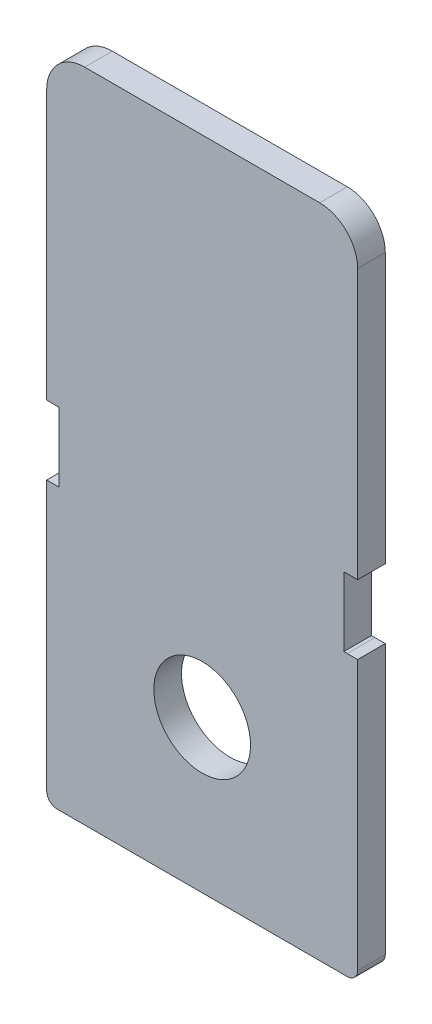
ISO-10303-21;
HEADER;
FILE_DESCRIPTION(('STEP AP214'),'2;1');
FILE_NAME('part.step','',(''),(''),'','','');
FILE_SCHEMA(('AUTOMOTIVE_DESIGN { 1 0 10303 214 1 1 1 1 }'));
ENDSEC;
DATA;
#1=APPLICATION_CONTEXT('core data for automotive mechanical design processes');
#2=APPLICATION_PROTOCOL_DEFINITION('international standard','automotive_design',2000,#1);
#3=PRODUCT_CONTEXT('',#1,'mechanical');
#4=PRODUCT('Part','Part','',(#3));
#5=PRODUCT_RELATED_PRODUCT_CATEGORY('part','',(#4));
#6=PRODUCT_DEFINITION_FORMATION('','',#4);
#7=PRODUCT_DEFINITION_CONTEXT('part definition',#1,'design');
#8=PRODUCT_DEFINITION('design','',#6,#7);
#9=PRODUCT_DEFINITION_SHAPE('','',#8);
#10=(LENGTH_UNIT() NAMED_UNIT(*) SI_UNIT(.MILLI.,.METRE.));
#11=(NAMED_UNIT(*) PLANE_ANGLE_UNIT() SI_UNIT($,.RADIAN.));
#12=(NAMED_UNIT(*) SI_UNIT($,.STERADIAN.) SOLID_ANGLE_UNIT());
#13=UNCERTAINTY_MEASURE_WITH_UNIT(LENGTH_MEASURE(1.E-05),#10,'distance_accuracy_value','');
#14=(GEOMETRIC_REPRESENTATION_CONTEXT(3) GLOBAL_UNCERTAINTY_ASSIGNED_CONTEXT((#13)) GLOBAL_UNIT_ASSIGNED_CONTEXT((#10,
#11,#12)) REPRESENTATION_CONTEXT('',''));
#15=CARTESIAN_POINT('',(0.,0.,0.));
#16=DIRECTION('',(0.,0.,1.));
#17=DIRECTION('',(1.,0.,0.));
#18=AXIS2_PLACEMENT_3D('',#15,#16,#17);
#19=CARTESIAN_POINT('',(11.25,103.5,32.25));
#20=DIRECTION('',(-1.,0.,0.));
#21=DIRECTION('',(0.,0.,1.));
#22=AXIS2_PLACEMENT_3D('',#19,#20,#21);
#23=PLANE('',#22);
#24=DIRECTION('',(0.,1.,0.));
#25=VECTOR('',#24,1.);
#26=CARTESIAN_POINT('',(11.25,79.,32.25));
#27=LINE('',#26,#25);
#28=CARTESIAN_POINT('',(11.25,103.5,32.25));
#29=VERTEX_POINT('',#28);
#30=CARTESIAN_POINT('',(11.25,123.,32.25));
#31=VERTEX_POINT('',#30);
#32=EDGE_CURVE('E257',#29,#31,#27,.T.);
#33=ORIENTED_EDGE('',*,*,#32,.F.);
#34=DIRECTION('',(0.,0.,1.));
#35=VECTOR('',#34,1.);
#36=CARTESIAN_POINT('',(11.25,103.5,30.25));
#37=LINE('',#36,#35);
#38=CARTESIAN_POINT('',(11.25,103.5,30.25));
#39=VERTEX_POINT('',#38);
#40=EDGE_CURVE('E231',#39,#29,#37,.T.);
#41=ORIENTED_EDGE('',*,*,#40,.F.);
#42=DIRECTION('',(0.,1.,0.));
#43=VECTOR('',#42,1.);
#44=CARTESIAN_POINT('',(11.25,103.5,30.25));
#45=LINE('',#44,#43);
#46=CARTESIAN_POINT('',(11.25,123.,30.25));
#47=VERTEX_POINT('',#46);
#48=EDGE_CURVE('E277',#39,#47,#45,.T.);
#49=ORIENTED_EDGE('',*,*,#48,.T.);
#50=DIRECTION('',(0.,0.,-1.));
#51=VECTOR('',#50,1.);
#52=CARTESIAN_POINT('',(11.25,123.,32.25));
#53=LINE('',#52,#51);
#54=EDGE_CURVE('E302',#31,#47,#53,.T.);
#55=ORIENTED_EDGE('',*,*,#54,.F.);
#56=EDGE_LOOP('',(#33,#41,#49,#55));
#57=FACE_BOUND('',#56,.T.);
#58=ADVANCED_FACE('F52',(#57),#23,.F.);
#59=CARTESIAN_POINT('',(-11.25,98.5,32.25));
#60=DIRECTION('',(1.,0.,0.));
#61=DIRECTION('',(0.,1.,0.));
#62=AXIS2_PLACEMENT_3D('',#59,#60,#61);
#63=PLANE('',#62);
#64=DIRECTION('',(0.,-1.,0.));
#65=VECTOR('',#64,1.);
#66=CARTESIAN_POINT('',(-11.2499999999986,123.000004119294,32.25));
#67=LINE('',#66,#65);
#68=CARTESIAN_POINT('',(-11.2499999999992,98.5,32.25));
#69=VERTEX_POINT('',#68);
#70=CARTESIAN_POINT('',(-11.25,79.,32.25));
#71=VERTEX_POINT('',#70);
#72=EDGE_CURVE('E267',#69,#71,#67,.T.);
#73=ORIENTED_EDGE('',*,*,#72,.F.);
#74=DIRECTION('',(0.,0.,1.));
#75=VECTOR('',#74,1.);
#76=CARTESIAN_POINT('',(-11.2499999999992,98.5,30.25));
#77=LINE('',#76,#75);
#78=CARTESIAN_POINT('',(-11.2499999999992,98.5,30.25));
#79=VERTEX_POINT('',#78);
#80=EDGE_CURVE('E229',#79,#69,#77,.T.);
#81=ORIENTED_EDGE('',*,*,#80,.F.);
#82=DIRECTION('',(0.,-1.,0.));
#83=VECTOR('',#82,1.);
#84=CARTESIAN_POINT('',(-11.25,98.5,30.25));
#85=LINE('',#84,#83);
#86=CARTESIAN_POINT('',(-11.25,79.,30.25));
#87=VERTEX_POINT('',#86);
#88=EDGE_CURVE('E288',#79,#87,#85,.T.);
#89=ORIENTED_EDGE('',*,*,#88,.T.);
#90=DIRECTION('',(0.,0.,-1.));
#91=VECTOR('',#90,1.);
#92=CARTESIAN_POINT('',(-11.25,79.,32.25));
#93=LINE('',#92,#91);
#94=EDGE_CURVE('E269',#71,#87,#93,.T.);
#95=ORIENTED_EDGE('',*,*,#94,.F.);
#96=EDGE_LOOP('',(#73,#81,#89,#95));
#97=FACE_BOUND('',#96,.T.);
#98=ADVANCED_FACE('F352',(#97),#63,.F.);
#99=CARTESIAN_POINT('',(-10.5,79.,32.25));
#100=DIRECTION('',(0.,0.,1.));
#101=DIRECTION('',(1.,0.,0.));
#102=AXIS2_PLACEMENT_3D('',#99,#100,#101);
#103=PLANE('',#102);
#104=CARTESIAN_POINT('',(0.,89.25,32.25));
#105=DIRECTION('',(0.,0.,1.));
#106=DIRECTION('',(1.,0.,0.));
#107=AXIS2_PLACEMENT_3D('',#104,#105,#106);
#108=CIRCLE('',#107,3.5);
#109=CARTESIAN_POINT('',(3.5,89.25,32.25));
#110=VERTEX_POINT('',#109);
#111=EDGE_CURVE('E201',#110,#110,#108,.T.);
#112=ORIENTED_EDGE('',*,*,#111,.F.);
#113=EDGE_LOOP('',(#112));
#114=FACE_BOUND('',#113,.T.);
#115=DIRECTION('',(-1.,0.,0.));
#116=VECTOR('',#115,1.);
#117=CARTESIAN_POINT('',(-10.5,103.5,32.25));
#118=LINE('',#117,#116);
#119=CARTESIAN_POINT('',(10.25,103.5,32.25));
#120=VERTEX_POINT('',#119);
#121=EDGE_CURVE('E246',#29,#120,#118,.T.);
#122=ORIENTED_EDGE('',*,*,#121,.F.);
#123=ORIENTED_EDGE('',*,*,#32,.T.);
#124=CARTESIAN_POINT('',(8.5,123.,32.25));
#125=DIRECTION('',(0.,0.,1.));
#126=DIRECTION('',(1.,0.,0.));
#127=AXIS2_PLACEMENT_3D('',#124,#125,#126);
#128=CIRCLE('',#127,2.75);
#129=CARTESIAN_POINT('',(8.5,125.75,32.25));
#130=VERTEX_POINT('',#129);
#131=EDGE_CURVE('E261',#31,#130,#128,.T.);
#132=ORIENTED_EDGE('',*,*,#131,.T.);
#133=DIRECTION('',(-1.,0.,0.));
#134=VECTOR('',#133,1.);
#135=CARTESIAN_POINT('',(8.5,125.75,32.25));
#136=LINE('',#135,#134);
#137=CARTESIAN_POINT('',(-8.5,125.750000000001,32.25));
#138=VERTEX_POINT('',#137);
#139=EDGE_CURVE('E263',#130,#138,#136,.T.);
#140=ORIENTED_EDGE('',*,*,#139,.T.);
#141=CARTESIAN_POINT('',(-8.5,123.,32.25));
#142=DIRECTION('',(0.,0.,1.));
#143=DIRECTION('',(1.,0.,0.));
#144=AXIS2_PLACEMENT_3D('',#141,#142,#143);
#145=CIRCLE('',#144,2.75000000000084);
#146=CARTESIAN_POINT('',(-11.2499999999986,123.000004119294,32.25));
#147=VERTEX_POINT('',#146);
#148=EDGE_CURVE('E265',#138,#147,#145,.T.);
#149=ORIENTED_EDGE('',*,*,#148,.T.);
#150=CARTESIAN_POINT('',(-11.2499999999992,103.5,32.25));
#151=VERTEX_POINT('',#150);
#152=EDGE_CURVE('E181',#147,#151,#67,.T.);
#153=ORIENTED_EDGE('',*,*,#152,.T.);
#154=DIRECTION('',(-1.,0.,0.));
#155=VECTOR('',#154,1.);
#156=CARTESIAN_POINT('',(-10.5,103.5,32.25));
#157=LINE('',#156,#155);
#158=CARTESIAN_POINT('',(-10.3749999999996,103.5,32.25));
#159=VERTEX_POINT('',#158);
#160=EDGE_CURVE('E175',#159,#151,#157,.T.);
#161=ORIENTED_EDGE('',*,*,#160,.F.);
#162=DIRECTION('',(0.,-1.,0.));
#163=VECTOR('',#162,1.);
#164=CARTESIAN_POINT('',(-10.3749999999996,103.5,32.25));
#165=LINE('',#164,#163);
#166=CARTESIAN_POINT('',(-10.3749999999996,98.5,32.25));
#167=VERTEX_POINT('',#166);
#168=EDGE_CURVE('E179',#159,#167,#165,.T.);
#169=ORIENTED_EDGE('',*,*,#168,.T.);
#170=DIRECTION('',(1.,0.,0.));
#171=VECTOR('',#170,1.);
#172=CARTESIAN_POINT('',(-10.5,98.5,32.25));
#173=LINE('',#172,#171);
#174=EDGE_CURVE('E72',#69,#167,#173,.T.);
#175=ORIENTED_EDGE('',*,*,#174,.F.);
#176=ORIENTED_EDGE('',*,*,#72,.T.);
#177=CARTESIAN_POINT('',(-10.5,79.,32.25));
#178=DIRECTION('',(0.,0.,1.));
#179=DIRECTION('',(1.,0.,0.));
#180=AXIS2_PLACEMENT_3D('',#177,#178,#179);
#181=CIRCLE('',#180,0.75);
#182=CARTESIAN_POINT('',(-10.5,78.25,32.25));
#183=VERTEX_POINT('',#182);
#184=EDGE_CURVE('E249',#71,#183,#181,.T.);
#185=ORIENTED_EDGE('',*,*,#184,.T.);
#186=DIRECTION('',(1.,0.,0.));
#187=VECTOR('',#186,1.);
#188=CARTESIAN_POINT('',(-10.5,78.25,32.25));
#189=LINE('',#188,#187);
#190=CARTESIAN_POINT('',(10.5,78.25,32.25));
#191=VERTEX_POINT('',#190);
#192=EDGE_CURVE('E252',#183,#191,#189,.T.);
#193=ORIENTED_EDGE('',*,*,#192,.T.);
#194=CARTESIAN_POINT('',(10.5,79.,32.25));
#195=DIRECTION('',(0.,0.,1.));
#196=DIRECTION('',(1.,0.,0.));
#197=AXIS2_PLACEMENT_3D('',#194,#195,#196);
#198=CIRCLE('',#197,0.750000000000001);
#199=CARTESIAN_POINT('',(11.25,79.,32.25));
#200=VERTEX_POINT('',#199);
#201=EDGE_CURVE('E255',#191,#200,#198,.T.);
#202=ORIENTED_EDGE('',*,*,#201,.T.);
#203=CARTESIAN_POINT('',(11.25,98.4974343163962,32.25));
#204=VERTEX_POINT('',#203);
#205=EDGE_CURVE('E258',#200,#204,#27,.T.);
#206=ORIENTED_EDGE('',*,*,#205,.T.);
#207=DIRECTION('',(1.,0.,0.));
#208=VECTOR('',#207,1.);
#209=CARTESIAN_POINT('',(10.5,98.4974343163962,32.25));
#210=LINE('',#209,#208);
#211=CARTESIAN_POINT('',(10.5,98.4974343163962,32.25));
#212=VERTEX_POINT('',#211);
#213=EDGE_CURVE('E223',#212,#204,#210,.T.);
#214=ORIENTED_EDGE('',*,*,#213,.F.);
#215=DIRECTION('',(0.,-1.,0.));
#216=VECTOR('',#215,1.);
#217=CARTESIAN_POINT('',(10.5,103.5,32.25));
#218=LINE('',#217,#216);
#219=CARTESIAN_POINT('',(10.5,98.4974692192679,32.25));
#220=VERTEX_POINT('',#219);
#221=EDGE_CURVE('E227',#220,#212,#218,.T.);
#222=ORIENTED_EDGE('',*,*,#221,.F.);
#223=DIRECTION('',(1.,0.,0.));
#224=VECTOR('',#223,1.);
#225=CARTESIAN_POINT('',(-10.5,98.4974692192679,32.25));
#226=LINE('',#225,#224);
#227=CARTESIAN_POINT('',(10.25,98.4974692192679,32.25));
#228=VERTEX_POINT('',#227);
#229=EDGE_CURVE('E244',#228,#220,#226,.T.);
#230=ORIENTED_EDGE('',*,*,#229,.F.);
#231=DIRECTION('',(0.,1.,0.));
#232=VECTOR('',#231,1.);
#233=CARTESIAN_POINT('',(10.25,103.5,32.25));
#234=LINE('',#233,#232);
#235=EDGE_CURVE('E205',#228,#120,#234,.T.);
#236=ORIENTED_EDGE('',*,*,#235,.T.);
#237=EDGE_LOOP('',(#122,#123,#132,#140,#149,#153,#161,#169,#175,#176,#185,#193,#202,#206,#214,
#222,#230,#236));
#238=FACE_BOUND('',#237,.T.);
#239=ADVANCED_FACE('F177',(#114,#238),#103,.T.);
#240=CARTESIAN_POINT('',(-10.5,79.,30.25));
#241=DIRECTION('',(0.,0.,1.));
#242=DIRECTION('',(1.,0.,0.));
#243=AXIS2_PLACEMENT_3D('',#240,#241,#242);
#244=PLANE('',#243);
#245=CARTESIAN_POINT('',(0.,89.25,30.25));
#246=DIRECTION('',(0.,0.,1.));
#247=DIRECTION('',(1.,0.,0.));
#248=AXIS2_PLACEMENT_3D('',#245,#246,#247);
#249=CIRCLE('',#248,3.5);
#250=CARTESIAN_POINT('',(3.5,89.25,30.25));
#251=VERTEX_POINT('',#250);
#252=EDGE_CURVE('E197',#251,#251,#249,.T.);
#253=ORIENTED_EDGE('',*,*,#252,.T.);
#254=EDGE_LOOP('',(#253));
#255=FACE_BOUND('',#254,.T.);
#256=ORIENTED_EDGE('',*,*,#48,.F.);
#257=DIRECTION('',(-1.,0.,0.));
#258=VECTOR('',#257,1.);
#259=CARTESIAN_POINT('',(-10.5,103.5,30.25));
#260=LINE('',#259,#258);
#261=CARTESIAN_POINT('',(10.25,103.5,30.25));
#262=VERTEX_POINT('',#261);
#263=EDGE_CURVE('E12',#39,#262,#260,.T.);
#264=ORIENTED_EDGE('',*,*,#263,.T.);
#265=DIRECTION('',(0.,1.,0.));
#266=VECTOR('',#265,1.);
#267=CARTESIAN_POINT('',(10.25,103.5,30.25));
#268=LINE('',#267,#266);
#269=CARTESIAN_POINT('',(10.25,98.4974692192679,30.25));
#270=VERTEX_POINT('',#269);
#271=EDGE_CURVE('E207',#270,#262,#268,.T.);
#272=ORIENTED_EDGE('',*,*,#271,.F.);
#273=DIRECTION('',(1.,0.,0.));
#274=VECTOR('',#273,1.);
#275=CARTESIAN_POINT('',(-10.5,98.4974692192679,30.25));
#276=LINE('',#275,#274);
#277=CARTESIAN_POINT('',(10.5,98.4974692192679,30.25));
#278=VERTEX_POINT('',#277);
#279=EDGE_CURVE('E60',#270,#278,#276,.T.);
#280=ORIENTED_EDGE('',*,*,#279,.T.);
#281=DIRECTION('',(0.,-1.,0.));
#282=VECTOR('',#281,1.);
#283=CARTESIAN_POINT('',(10.5,103.5,30.25));
#284=LINE('',#283,#282);
#285=CARTESIAN_POINT('',(10.5,98.4974343163962,30.25));
#286=VERTEX_POINT('',#285);
#287=EDGE_CURVE('E219',#278,#286,#284,.T.);
#288=ORIENTED_EDGE('',*,*,#287,.T.);
#289=DIRECTION('',(1.,0.,0.));
#290=VECTOR('',#289,1.);
#291=CARTESIAN_POINT('',(10.5,98.4974343163962,30.25));
#292=LINE('',#291,#290);
#293=CARTESIAN_POINT('',(11.25,98.4974343163962,30.25));
#294=VERTEX_POINT('',#293);
#295=EDGE_CURVE('E222',#286,#294,#292,.T.);
#296=ORIENTED_EDGE('',*,*,#295,.T.);
#297=CARTESIAN_POINT('',(11.25,79.,30.25));
#298=VERTEX_POINT('',#297);
#299=EDGE_CURVE('E278',#298,#294,#45,.T.);
#300=ORIENTED_EDGE('',*,*,#299,.F.);
#301=CARTESIAN_POINT('',(10.5,79.,30.25));
#302=DIRECTION('',(0.,0.,1.));
#303=DIRECTION('',(1.,0.,0.));
#304=AXIS2_PLACEMENT_3D('',#301,#302,#303);
#305=CIRCLE('',#304,0.750000000000001);
#306=CARTESIAN_POINT('',(10.5,78.25,30.25));
#307=VERTEX_POINT('',#306);
#308=EDGE_CURVE('E274',#307,#298,#305,.T.);
#309=ORIENTED_EDGE('',*,*,#308,.F.);
#310=DIRECTION('',(1.,0.,0.));
#311=VECTOR('',#310,1.);
#312=CARTESIAN_POINT('',(-10.5,78.25,30.25));
#313=LINE('',#312,#311);
#314=CARTESIAN_POINT('',(-10.5,78.25,30.25));
#315=VERTEX_POINT('',#314);
#316=EDGE_CURVE('E272',#315,#307,#313,.T.);
#317=ORIENTED_EDGE('',*,*,#316,.F.);
#318=CARTESIAN_POINT('',(-10.5,79.,30.25));
#319=DIRECTION('',(0.,0.,1.));
#320=DIRECTION('',(1.,0.,0.));
#321=AXIS2_PLACEMENT_3D('',#318,#319,#320);
#322=CIRCLE('',#321,0.75);
#323=EDGE_CURVE('E248',#87,#315,#322,.T.);
#324=ORIENTED_EDGE('',*,*,#323,.F.);
#325=ORIENTED_EDGE('',*,*,#88,.F.);
#326=DIRECTION('',(1.,0.,0.));
#327=VECTOR('',#326,1.);
#328=CARTESIAN_POINT('',(-10.5,98.5,30.25));
#329=LINE('',#328,#327);
#330=CARTESIAN_POINT('',(-10.3749999999996,98.5,30.25));
#331=VERTEX_POINT('',#330);
#332=EDGE_CURVE('E315',#79,#331,#329,.T.);
#333=ORIENTED_EDGE('',*,*,#332,.T.);
#334=DIRECTION('',(0.,-1.,0.));
#335=VECTOR('',#334,1.);
#336=CARTESIAN_POINT('',(-10.3749999999996,103.5,30.25));
#337=LINE('',#336,#335);
#338=CARTESIAN_POINT('',(-10.3749999999996,103.5,30.25));
#339=VERTEX_POINT('',#338);
#340=EDGE_CURVE('E194',#339,#331,#337,.T.);
#341=ORIENTED_EDGE('',*,*,#340,.F.);
#342=DIRECTION('',(-1.,0.,0.));
#343=VECTOR('',#342,1.);
#344=CARTESIAN_POINT('',(-10.5,103.5,30.25));
#345=LINE('',#344,#343);
#346=CARTESIAN_POINT('',(-11.2499999999992,103.5,30.25));
#347=VERTEX_POINT('',#346);
#348=EDGE_CURVE('E190',#339,#347,#345,.T.);
#349=ORIENTED_EDGE('',*,*,#348,.T.);
#350=CARTESIAN_POINT('',(-11.2499999999986,123.000004119294,30.25));
#351=VERTEX_POINT('',#350);
#352=EDGE_CURVE('E253',#351,#347,#85,.T.);
#353=ORIENTED_EDGE('',*,*,#352,.F.);
#354=CARTESIAN_POINT('',(-8.5,123.,30.25));
#355=DIRECTION('',(0.,0.,1.));
#356=DIRECTION('',(1.,0.,0.));
#357=AXIS2_PLACEMENT_3D('',#354,#355,#356);
#358=CIRCLE('',#357,2.75000000000084);
#359=CARTESIAN_POINT('',(-8.5,125.750000000001,30.25));
#360=VERTEX_POINT('',#359);
#361=EDGE_CURVE('E285',#360,#351,#358,.T.);
#362=ORIENTED_EDGE('',*,*,#361,.F.);
#363=DIRECTION('',(-1.,0.,0.));
#364=VECTOR('',#363,1.);
#365=CARTESIAN_POINT('',(8.5,125.75,30.25));
#366=LINE('',#365,#364);
#367=CARTESIAN_POINT('',(8.5,125.75,30.25));
#368=VERTEX_POINT('',#367);
#369=EDGE_CURVE('E283',#368,#360,#366,.T.);
#370=ORIENTED_EDGE('',*,*,#369,.F.);
#371=CARTESIAN_POINT('',(8.5,123.,30.25));
#372=DIRECTION('',(0.,0.,1.));
#373=DIRECTION('',(1.,0.,0.));
#374=AXIS2_PLACEMENT_3D('',#371,#372,#373);
#375=CIRCLE('',#374,2.75);
#376=EDGE_CURVE('E281',#47,#368,#375,.T.);
#377=ORIENTED_EDGE('',*,*,#376,.F.);
#378=EDGE_LOOP('',(#256,#264,#272,#280,#288,#296,#300,#309,#317,#324,#325,#333,#341,#349,#353,
#362,#370,#377));
#379=FACE_BOUND('',#378,.T.);
#380=ADVANCED_FACE('F320',(#255,#379),#244,.F.);
#381=CARTESIAN_POINT('',(-10.5,79.,32.25));
#382=DIRECTION('',(0.,0.,-1.));
#383=DIRECTION('',(-1.,0.,0.));
#384=AXIS2_PLACEMENT_3D('',#381,#382,#383);
#385=CYLINDRICAL_SURFACE('',#384,0.75);
#386=ORIENTED_EDGE('',*,*,#323,.T.);
#387=DIRECTION('',(0.,0.,-1.));
#388=VECTOR('',#387,1.);
#389=CARTESIAN_POINT('',(-10.5,78.25,32.25));
#390=LINE('',#389,#388);
#391=EDGE_CURVE('E311',#183,#315,#390,.T.);
#392=ORIENTED_EDGE('',*,*,#391,.F.);
#393=ORIENTED_EDGE('',*,*,#184,.F.);
#394=ORIENTED_EDGE('',*,*,#94,.T.);
#395=EDGE_LOOP('',(#386,#392,#393,#394));
#396=FACE_BOUND('',#395,.T.);
#397=ADVANCED_FACE('F54',(#396),#385,.T.);
#398=CARTESIAN_POINT('',(-10.5,78.25,32.25));
#399=DIRECTION('',(0.,1.,0.));
#400=DIRECTION('',(0.,0.,1.));
#401=AXIS2_PLACEMENT_3D('',#398,#399,#400);
#402=PLANE('',#401);
#403=ORIENTED_EDGE('',*,*,#316,.T.);
#404=DIRECTION('',(0.,0.,-1.));
#405=VECTOR('',#404,1.);
#406=CARTESIAN_POINT('',(10.5,78.25,32.25));
#407=LINE('',#406,#405);
#408=EDGE_CURVE('E308',#191,#307,#407,.T.);
#409=ORIENTED_EDGE('',*,*,#408,.F.);
#410=ORIENTED_EDGE('',*,*,#192,.F.);
#411=ORIENTED_EDGE('',*,*,#391,.T.);
#412=EDGE_LOOP('',(#403,#409,#410,#411));
#413=FACE_BOUND('',#412,.T.);
#414=ADVANCED_FACE('F346',(#413),#402,.F.);
#415=CARTESIAN_POINT('',(10.5,79.,32.25));
#416=DIRECTION('',(0.,0.,-1.));
#417=DIRECTION('',(-1.,0.,0.));
#418=AXIS2_PLACEMENT_3D('',#415,#416,#417);
#419=CYLINDRICAL_SURFACE('',#418,0.750000000000001);
#420=ORIENTED_EDGE('',*,*,#308,.T.);
#421=DIRECTION('',(0.,0.,-1.));
#422=VECTOR('',#421,1.);
#423=CARTESIAN_POINT('',(11.25,79.,32.25));
#424=LINE('',#423,#422);
#425=EDGE_CURVE('E305',#200,#298,#424,.T.);
#426=ORIENTED_EDGE('',*,*,#425,.F.);
#427=ORIENTED_EDGE('',*,*,#201,.F.);
#428=ORIENTED_EDGE('',*,*,#408,.T.);
#429=EDGE_LOOP('',(#420,#426,#427,#428));
#430=FACE_BOUND('',#429,.T.);
#431=ADVANCED_FACE('F340',(#430),#419,.T.);
#432=ORIENTED_EDGE('',*,*,#299,.T.);
#433=DIRECTION('',(0.,0.,1.));
#434=VECTOR('',#433,1.);
#435=CARTESIAN_POINT('',(11.25,98.4974343163962,30.25));
#436=LINE('',#435,#434);
#437=EDGE_CURVE('E234',#294,#204,#436,.T.);
#438=ORIENTED_EDGE('',*,*,#437,.T.);
#439=ORIENTED_EDGE('',*,*,#205,.F.);
#440=ORIENTED_EDGE('',*,*,#425,.T.);
#441=EDGE_LOOP('',(#432,#438,#439,#440));
#442=FACE_BOUND('',#441,.T.);
#443=ADVANCED_FACE('F335',(#442),#23,.F.);
#444=CARTESIAN_POINT('',(8.5,123.,32.25));
#445=DIRECTION('',(0.,0.,-1.));
#446=DIRECTION('',(-1.,0.,0.));
#447=AXIS2_PLACEMENT_3D('',#444,#445,#446);
#448=CYLINDRICAL_SURFACE('',#447,2.75);
#449=ORIENTED_EDGE('',*,*,#376,.T.);
#450=DIRECTION('',(0.,0.,-1.));
#451=VECTOR('',#450,1.);
#452=CARTESIAN_POINT('',(8.5,125.75,32.25));
#453=LINE('',#452,#451);
#454=EDGE_CURVE('E299',#130,#368,#453,.T.);
#455=ORIENTED_EDGE('',*,*,#454,.F.);
#456=ORIENTED_EDGE('',*,*,#131,.F.);
#457=ORIENTED_EDGE('',*,*,#54,.T.);
#458=EDGE_LOOP('',(#449,#455,#456,#457));
#459=FACE_BOUND('',#458,.T.);
#460=ADVANCED_FACE('F378',(#459),#448,.T.);
#461=CARTESIAN_POINT('',(8.5,125.75,32.25));
#462=DIRECTION('',(0.,-1.,0.));
#463=DIRECTION('',(0.,0.,-1.));
#464=AXIS2_PLACEMENT_3D('',#461,#462,#463);
#465=PLANE('',#464);
#466=ORIENTED_EDGE('',*,*,#369,.T.);
#467=DIRECTION('',(0.,0.,-1.));
#468=VECTOR('',#467,1.);
#469=CARTESIAN_POINT('',(-8.5,125.750000000001,32.25));
#470=LINE('',#469,#468);
#471=EDGE_CURVE('E296',#138,#360,#470,.T.);
#472=ORIENTED_EDGE('',*,*,#471,.F.);
#473=ORIENTED_EDGE('',*,*,#139,.F.);
#474=ORIENTED_EDGE('',*,*,#454,.T.);
#475=EDGE_LOOP('',(#466,#472,#473,#474));
#476=FACE_BOUND('',#475,.T.);
#477=ADVANCED_FACE('F383',(#476),#465,.F.);
#478=CARTESIAN_POINT('',(-8.5,123.,32.25));
#479=DIRECTION('',(0.,0.,-1.));
#480=DIRECTION('',(-1.,0.,0.));
#481=AXIS2_PLACEMENT_3D('',#478,#479,#480);
#482=CYLINDRICAL_SURFACE('',#481,2.75000000000084);
#483=ORIENTED_EDGE('',*,*,#361,.T.);
#484=DIRECTION('',(0.,0.,-1.));
#485=VECTOR('',#484,1.);
#486=CARTESIAN_POINT('',(-11.2499999999986,123.000004119294,32.25));
#487=LINE('',#486,#485);
#488=EDGE_CURVE('E293',#147,#351,#487,.T.);
#489=ORIENTED_EDGE('',*,*,#488,.F.);
#490=ORIENTED_EDGE('',*,*,#148,.F.);
#491=ORIENTED_EDGE('',*,*,#471,.T.);
#492=EDGE_LOOP('',(#483,#489,#490,#491));
#493=FACE_BOUND('',#492,.T.);
#494=ADVANCED_FACE('F364',(#493),#482,.T.);
#495=ORIENTED_EDGE('',*,*,#352,.T.);
#496=DIRECTION('',(0.,0.,1.));
#497=VECTOR('',#496,1.);
#498=CARTESIAN_POINT('',(-11.2499999999992,103.5,30.25));
#499=LINE('',#498,#497);
#500=EDGE_CURVE('E216',#347,#151,#499,.T.);
#501=ORIENTED_EDGE('',*,*,#500,.T.);
#502=ORIENTED_EDGE('',*,*,#152,.F.);
#503=ORIENTED_EDGE('',*,*,#488,.T.);
#504=EDGE_LOOP('',(#495,#501,#502,#503));
#505=FACE_BOUND('',#504,.T.);
#506=ADVANCED_FACE('F356',(#505),#63,.F.);
#507=CARTESIAN_POINT('',(-10.5,98.5,37.25));
#508=DIRECTION('',(0.,-1.,0.));
#509=DIRECTION('',(0.,0.,-1.));
#510=AXIS2_PLACEMENT_3D('',#507,#508,#509);
#511=PLANE('',#510);
#512=ORIENTED_EDGE('',*,*,#174,.T.);
#513=DIRECTION('',(0.,0.,1.));
#514=VECTOR('',#513,1.);
#515=CARTESIAN_POINT('',(-10.3749999999996,98.5,30.25));
#516=LINE('',#515,#514);
#517=EDGE_CURVE('E67',#331,#167,#516,.T.);
#518=ORIENTED_EDGE('',*,*,#517,.F.);
#519=ORIENTED_EDGE('',*,*,#332,.F.);
#520=ORIENTED_EDGE('',*,*,#80,.T.);
#521=EDGE_LOOP('',(#512,#518,#519,#520));
#522=FACE_BOUND('',#521,.T.);
#523=ADVANCED_FACE('F354',(#522),#511,.F.);
#524=CARTESIAN_POINT('',(-10.5,103.5,37.25));
#525=DIRECTION('',(0.,1.,0.));
#526=DIRECTION('',(0.,0.,1.));
#527=AXIS2_PLACEMENT_3D('',#524,#525,#526);
#528=PLANE('',#527);
#529=ORIENTED_EDGE('',*,*,#348,.F.);
#530=DIRECTION('',(0.,0.,1.));
#531=VECTOR('',#530,1.);
#532=CARTESIAN_POINT('',(-10.3749999999996,103.5,30.25));
#533=LINE('',#532,#531);
#534=EDGE_CURVE('E188',#339,#159,#533,.T.);
#535=ORIENTED_EDGE('',*,*,#534,.T.);
#536=ORIENTED_EDGE('',*,*,#160,.T.);
#537=ORIENTED_EDGE('',*,*,#500,.F.);
#538=EDGE_LOOP('',(#529,#535,#536,#537));
#539=FACE_BOUND('',#538,.T.);
#540=ADVANCED_FACE('F189',(#539),#528,.F.);
#541=CARTESIAN_POINT('',(10.5,103.5,37.25));
#542=DIRECTION('',(0.,1.,0.));
#543=DIRECTION('',(0.,0.,1.));
#544=AXIS2_PLACEMENT_3D('',#541,#542,#543);
#545=PLANE('',#544);
#546=ORIENTED_EDGE('',*,*,#121,.T.);
#547=DIRECTION('',(0.,0.,1.));
#548=VECTOR('',#547,1.);
#549=CARTESIAN_POINT('',(10.25,103.5,30.25));
#550=LINE('',#549,#548);
#551=EDGE_CURVE('E213',#262,#120,#550,.T.);
#552=ORIENTED_EDGE('',*,*,#551,.F.);
#553=ORIENTED_EDGE('',*,*,#263,.F.);
#554=ORIENTED_EDGE('',*,*,#40,.T.);
#555=EDGE_LOOP('',(#546,#552,#553,#554));
#556=FACE_BOUND('',#555,.T.);
#557=ADVANCED_FACE('F362',(#556),#545,.F.);
#558=CARTESIAN_POINT('',(10.5,98.4974692192679,37.25));
#559=DIRECTION('',(0.,-1.,0.));
#560=DIRECTION('',(0.,0.,-1.));
#561=AXIS2_PLACEMENT_3D('',#558,#559,#560);
#562=PLANE('',#561);
#563=ORIENTED_EDGE('',*,*,#279,.F.);
#564=DIRECTION('',(0.,0.,1.));
#565=VECTOR('',#564,1.);
#566=CARTESIAN_POINT('',(10.25,98.4974692192679,30.25));
#567=LINE('',#566,#565);
#568=EDGE_CURVE('E210',#270,#228,#567,.T.);
#569=ORIENTED_EDGE('',*,*,#568,.T.);
#570=ORIENTED_EDGE('',*,*,#229,.T.);
#571=DIRECTION('',(0.,0.,-1.));
#572=VECTOR('',#571,1.);
#573=CARTESIAN_POINT('',(10.5,98.4974692192679,37.25));
#574=LINE('',#573,#572);
#575=EDGE_CURVE('E185',#220,#278,#574,.T.);
#576=ORIENTED_EDGE('',*,*,#575,.T.);
#577=EDGE_LOOP('',(#563,#569,#570,#576));
#578=FACE_BOUND('',#577,.T.);
#579=ADVANCED_FACE('F328',(#578),#562,.F.);
#580=CARTESIAN_POINT('',(10.5,103.5,30.25));
#581=DIRECTION('',(-1.,0.,0.));
#582=DIRECTION('',(0.,0.,1.));
#583=AXIS2_PLACEMENT_3D('',#580,#581,#582);
#584=PLANE('',#583);
#585=ORIENTED_EDGE('',*,*,#221,.T.);
#586=DIRECTION('',(0.,0.,1.));
#587=VECTOR('',#586,1.);
#588=CARTESIAN_POINT('',(10.5,98.4974343163962,30.25));
#589=LINE('',#588,#587);
#590=EDGE_CURVE('E226',#286,#212,#589,.T.);
#591=ORIENTED_EDGE('',*,*,#590,.F.);
#592=ORIENTED_EDGE('',*,*,#287,.F.);
#593=ORIENTED_EDGE('',*,*,#575,.F.);
#594=EDGE_LOOP('',(#585,#591,#592,#593));
#595=FACE_BOUND('',#594,.T.);
#596=ADVANCED_FACE('F325',(#595),#584,.F.);
#597=CARTESIAN_POINT('',(10.5,98.4974343163962,30.25));
#598=DIRECTION('',(0.,-1.,0.));
#599=DIRECTION('',(0.,0.,-1.));
#600=AXIS2_PLACEMENT_3D('',#597,#598,#599);
#601=PLANE('',#600);
#602=ORIENTED_EDGE('',*,*,#213,.T.);
#603=ORIENTED_EDGE('',*,*,#437,.F.);
#604=ORIENTED_EDGE('',*,*,#295,.F.);
#605=ORIENTED_EDGE('',*,*,#590,.T.);
#606=EDGE_LOOP('',(#602,#603,#604,#605));
#607=FACE_BOUND('',#606,.T.);
#608=ADVANCED_FACE('F332',(#607),#601,.F.);
#609=CARTESIAN_POINT('',(10.25,103.5,30.25));
#610=DIRECTION('',(1.,0.,0.));
#611=DIRECTION('',(0.,0.,-1.));
#612=AXIS2_PLACEMENT_3D('',#609,#610,#611);
#613=PLANE('',#612);
#614=ORIENTED_EDGE('',*,*,#235,.F.);
#615=ORIENTED_EDGE('',*,*,#568,.F.);
#616=ORIENTED_EDGE('',*,*,#271,.T.);
#617=ORIENTED_EDGE('',*,*,#551,.T.);
#618=EDGE_LOOP('',(#614,#615,#616,#617));
#619=FACE_BOUND('',#618,.T.);
#620=ADVANCED_FACE('F422',(#619),#613,.T.);
#621=CARTESIAN_POINT('',(-10.3749999999996,103.5,30.25));
#622=DIRECTION('',(-1.,0.,0.));
#623=DIRECTION('',(0.,0.,1.));
#624=AXIS2_PLACEMENT_3D('',#621,#622,#623);
#625=PLANE('',#624);
#626=ORIENTED_EDGE('',*,*,#168,.F.);
#627=ORIENTED_EDGE('',*,*,#534,.F.);
#628=ORIENTED_EDGE('',*,*,#340,.T.);
#629=ORIENTED_EDGE('',*,*,#517,.T.);
#630=EDGE_LOOP('',(#626,#627,#628,#629));
#631=FACE_BOUND('',#630,.T.);
#632=ADVANCED_FACE('F196',(#631),#625,.T.);
#633=CARTESIAN_POINT('',(0.,89.25,30.25));
#634=DIRECTION('',(0.,0.,1.));
#635=DIRECTION('',(1.,0.,0.));
#636=AXIS2_PLACEMENT_3D('',#633,#634,#635);
#637=CYLINDRICAL_SURFACE('',#636,3.5);
#638=ORIENTED_EDGE('',*,*,#252,.F.);
#639=EDGE_LOOP('',(#638));
#640=FACE_BOUND('',#639,.T.);
#641=ORIENTED_EDGE('',*,*,#111,.T.);
#642=EDGE_LOOP('',(#641));
#643=FACE_BOUND('',#642,.T.);
#644=ADVANCED_FACE('F429',(#640,#643),#637,.F.);
#645=CLOSED_SHELL('',(#58,#98,#239,#380,#397,#414,#431,#443,#460,#477,#494,#506,#523,#540,#557,
#579,#596,#608,#620,#632,#644));
#646=MANIFOLD_SOLID_BREP('B2',#645);
#647=ADVANCED_BREP_SHAPE_REPRESENTATION('',(#18,#646),#14);
#648=SHAPE_DEFINITION_REPRESENTATION(#9,#647);
ENDSEC;
END-ISO-10303-21;
